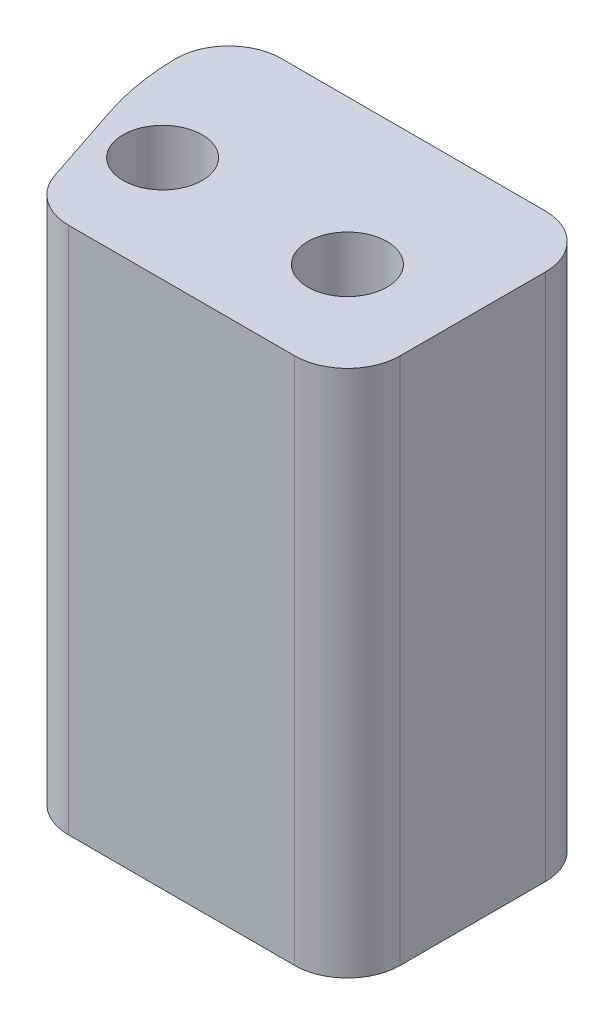
ISO-10303-21;
HEADER;
FILE_DESCRIPTION(('STEP AP214'),'2;1');
FILE_NAME('part.step','',(''),(''),'','','');
FILE_SCHEMA(('AUTOMOTIVE_DESIGN { 1 0 10303 214 1 1 1 1 }'));
ENDSEC;
DATA;
#1=APPLICATION_CONTEXT('core data for automotive mechanical design processes');
#2=APPLICATION_PROTOCOL_DEFINITION('international standard','automotive_design',2000,#1);
#3=PRODUCT_CONTEXT('',#1,'mechanical');
#4=PRODUCT('Part','Part','',(#3));
#5=PRODUCT_RELATED_PRODUCT_CATEGORY('part','',(#4));
#6=PRODUCT_DEFINITION_FORMATION('','',#4);
#7=PRODUCT_DEFINITION_CONTEXT('part definition',#1,'design');
#8=PRODUCT_DEFINITION('design','',#6,#7);
#9=PRODUCT_DEFINITION_SHAPE('','',#8);
#10=(LENGTH_UNIT() NAMED_UNIT(*) SI_UNIT(.MILLI.,.METRE.));
#11=(NAMED_UNIT(*) PLANE_ANGLE_UNIT() SI_UNIT($,.RADIAN.));
#12=(NAMED_UNIT(*) SI_UNIT($,.STERADIAN.) SOLID_ANGLE_UNIT());
#13=UNCERTAINTY_MEASURE_WITH_UNIT(LENGTH_MEASURE(1.E-05),#10,'distance_accuracy_value','');
#14=(GEOMETRIC_REPRESENTATION_CONTEXT(3) GLOBAL_UNCERTAINTY_ASSIGNED_CONTEXT((#13)) GLOBAL_UNIT_ASSIGNED_CONTEXT((#10,
#11,#12)) REPRESENTATION_CONTEXT('',''));
#15=CARTESIAN_POINT('',(0.,0.,0.));
#16=DIRECTION('',(0.,0.,1.));
#17=DIRECTION('',(1.,0.,0.));
#18=AXIS2_PLACEMENT_3D('',#15,#16,#17);
#19=CARTESIAN_POINT('',(0.,25.4,0.));
#20=DIRECTION('',(0.,1.,0.));
#21=DIRECTION('',(0.,0.,1.));
#22=AXIS2_PLACEMENT_3D('',#19,#20,#21);
#23=PLANE('',#22);
#24=CARTESIAN_POINT('',(-6.35,25.4,-3.49250000000001));
#25=DIRECTION('',(0.,1.,0.));
#26=DIRECTION('',(0.,0.,1.));
#27=AXIS2_PLACEMENT_3D('',#24,#25,#26);
#28=CIRCLE('',#27,2.54);
#29=CARTESIAN_POINT('',(-6.35,25.4,-6.03250000000001));
#30=VERTEX_POINT('',#29);
#31=CARTESIAN_POINT('',(-8.89,25.4,-3.49250000000001));
#32=VERTEX_POINT('',#31);
#33=EDGE_CURVE('E130',#30,#32,#28,.T.);
#34=ORIENTED_EDGE('',*,*,#33,.T.);
#35=CARTESIAN_POINT('',(3.80900578601359,25.4,-3.65140892609766));
#36=DIRECTION('',(0.,1.,0.));
#37=DIRECTION('',(0.,0.,1.));
#38=AXIS2_PLACEMENT_3D('',#35,#36,#37);
#39=CIRCLE('',#38,12.7);
#40=CARTESIAN_POINT('',(-8.23927209922794,25.4,0.364683702316184));
#41=VERTEX_POINT('',#40);
#42=EDGE_CURVE('E65',#32,#41,#39,.T.);
#43=ORIENTED_EDGE('',*,*,#42,.T.);
#44=DIRECTION('',(-0.316227766016838,0.,-0.948683298050514));
#45=VECTOR('',#44,1.);
#46=CARTESIAN_POINT('',(-8.89,25.4,-1.5875));
#47=LINE('',#46,#45);
#48=CARTESIAN_POINT('',(-6.92892715810574,25.4,4.29571852568276));
#49=VERTEX_POINT('',#48);
#50=EDGE_CURVE('E127',#49,#41,#47,.T.);
#51=ORIENTED_EDGE('',*,*,#50,.F.);
#52=CARTESIAN_POINT('',(-4.51927158105744,25.4,3.4925));
#53=DIRECTION('',(0.,1.,0.));
#54=DIRECTION('',(0.,0.,1.));
#55=AXIS2_PLACEMENT_3D('',#52,#53,#54);
#56=CIRCLE('',#55,2.54);
#57=CARTESIAN_POINT('',(-4.51927158105744,25.4,6.0325));
#58=VERTEX_POINT('',#57);
#59=EDGE_CURVE('E114',#49,#58,#56,.T.);
#60=ORIENTED_EDGE('',*,*,#59,.T.);
#61=DIRECTION('',(1.,0.,0.));
#62=VECTOR('',#61,1.);
#63=CARTESIAN_POINT('',(-8.89,25.4,6.03249999999999));
#64=LINE('',#63,#62);
#65=CARTESIAN_POINT('',(6.35,25.4,6.0325));
#66=VERTEX_POINT('',#65);
#67=EDGE_CURVE('E131',#58,#66,#64,.T.);
#68=ORIENTED_EDGE('',*,*,#67,.T.);
#69=CARTESIAN_POINT('',(6.35,25.4,3.4925));
#70=DIRECTION('',(0.,1.,0.));
#71=DIRECTION('',(0.,0.,1.));
#72=AXIS2_PLACEMENT_3D('',#69,#70,#71);
#73=CIRCLE('',#72,2.54);
#74=CARTESIAN_POINT('',(8.89,25.4,3.4925));
#75=VERTEX_POINT('',#74);
#76=EDGE_CURVE('E179',#66,#75,#73,.T.);
#77=ORIENTED_EDGE('',*,*,#76,.T.);
#78=DIRECTION('',(0.,0.,-1.));
#79=VECTOR('',#78,1.);
#80=CARTESIAN_POINT('',(8.89,25.4,-6.03250000000001));
#81=LINE('',#80,#79);
#82=CARTESIAN_POINT('',(8.89,25.4,-3.49250000000001));
#83=VERTEX_POINT('',#82);
#84=EDGE_CURVE('E156',#75,#83,#81,.T.);
#85=ORIENTED_EDGE('',*,*,#84,.T.);
#86=CARTESIAN_POINT('',(6.35,25.4,-3.49250000000001));
#87=DIRECTION('',(0.,1.,0.));
#88=DIRECTION('',(0.,0.,1.));
#89=AXIS2_PLACEMENT_3D('',#86,#87,#88);
#90=CIRCLE('',#89,2.54);
#91=CARTESIAN_POINT('',(6.35,25.4,-6.03250000000001));
#92=VERTEX_POINT('',#91);
#93=EDGE_CURVE('E124',#83,#92,#90,.T.);
#94=ORIENTED_EDGE('',*,*,#93,.T.);
#95=DIRECTION('',(-1.,0.,0.));
#96=VECTOR('',#95,1.);
#97=CARTESIAN_POINT('',(-8.89,25.4,-6.03250000000001));
#98=LINE('',#97,#96);
#99=EDGE_CURVE('E160',#92,#30,#98,.T.);
#100=ORIENTED_EDGE('',*,*,#99,.T.);
#101=EDGE_LOOP('',(#34,#43,#51,#60,#68,#77,#85,#94,#100));
#102=FACE_BOUND('',#101,.T.);
#103=CARTESIAN_POINT('',(-5.08,25.4,0.952499999999994));
#104=DIRECTION('',(0.,1.,0.));
#105=DIRECTION('',(0.,0.,1.));
#106=AXIS2_PLACEMENT_3D('',#103,#104,#105);
#107=CIRCLE('',#106,1.905);
#108=CARTESIAN_POINT('',(-5.08,25.4,2.85749999999999));
#109=VERTEX_POINT('',#108);
#110=EDGE_CURVE('E148',#109,#109,#107,.T.);
#111=ORIENTED_EDGE('',*,*,#110,.F.);
#112=EDGE_LOOP('',(#111));
#113=FACE_BOUND('',#112,.T.);
#114=CARTESIAN_POINT('',(3.81,25.4,0.952499999999994));
#115=DIRECTION('',(0.,1.,0.));
#116=DIRECTION('',(0.,0.,-1.));
#117=AXIS2_PLACEMENT_3D('',#114,#115,#116);
#118=CIRCLE('',#117,1.905);
#119=CARTESIAN_POINT('',(3.81,25.4,-0.952500000000005));
#120=VERTEX_POINT('',#119);
#121=EDGE_CURVE('E140',#120,#120,#118,.T.);
#122=ORIENTED_EDGE('',*,*,#121,.F.);
#123=EDGE_LOOP('',(#122));
#124=FACE_BOUND('',#123,.T.);
#125=ADVANCED_FACE('F42',(#102,#113,#124),#23,.T.);
#126=CARTESIAN_POINT('',(0.,0.,0.));
#127=DIRECTION('',(0.,1.,0.));
#128=DIRECTION('',(0.,0.,1.));
#129=AXIS2_PLACEMENT_3D('',#126,#127,#128);
#130=PLANE('',#129);
#131=DIRECTION('',(-0.316227766016838,0.,-0.948683298050514));
#132=VECTOR('',#131,1.);
#133=CARTESIAN_POINT('',(-8.89,0.,-1.5875));
#134=LINE('',#133,#132);
#135=CARTESIAN_POINT('',(-6.92892715810574,0.,4.29571852568276));
#136=VERTEX_POINT('',#135);
#137=CARTESIAN_POINT('',(-8.23927209922794,0.,0.364683702316185));
#138=VERTEX_POINT('',#137);
#139=EDGE_CURVE('E128',#136,#138,#134,.T.);
#140=ORIENTED_EDGE('',*,*,#139,.T.);
#141=CARTESIAN_POINT('',(3.80900578601359,0.,-3.65140892609766));
#142=DIRECTION('',(0.,1.,0.));
#143=DIRECTION('',(0.,0.,1.));
#144=AXIS2_PLACEMENT_3D('',#141,#142,#143);
#145=CIRCLE('',#144,12.7);
#146=CARTESIAN_POINT('',(-8.89,0.,-3.49250000000001));
#147=VERTEX_POINT('',#146);
#148=EDGE_CURVE('E11',#138,#147,#145,.F.);
#149=ORIENTED_EDGE('',*,*,#148,.T.);
#150=CARTESIAN_POINT('',(-6.35,0.,-3.49250000000001));
#151=DIRECTION('',(0.,1.,0.));
#152=DIRECTION('',(0.,0.,1.));
#153=AXIS2_PLACEMENT_3D('',#150,#151,#152);
#154=CIRCLE('',#153,2.54);
#155=CARTESIAN_POINT('',(-6.35,0.,-6.03250000000001));
#156=VERTEX_POINT('',#155);
#157=EDGE_CURVE('E188',#147,#156,#154,.F.);
#158=ORIENTED_EDGE('',*,*,#157,.T.);
#159=DIRECTION('',(-1.,0.,0.));
#160=VECTOR('',#159,1.);
#161=CARTESIAN_POINT('',(-8.89,0.,-6.03250000000001));
#162=LINE('',#161,#160);
#163=CARTESIAN_POINT('',(6.35,0.,-6.03250000000001));
#164=VERTEX_POINT('',#163);
#165=EDGE_CURVE('E170',#164,#156,#162,.T.);
#166=ORIENTED_EDGE('',*,*,#165,.F.);
#167=CARTESIAN_POINT('',(6.35,0.,-3.49250000000001));
#168=DIRECTION('',(0.,1.,0.));
#169=DIRECTION('',(0.,0.,1.));
#170=AXIS2_PLACEMENT_3D('',#167,#168,#169);
#171=CIRCLE('',#170,2.54);
#172=CARTESIAN_POINT('',(8.89,0.,-3.49250000000001));
#173=VERTEX_POINT('',#172);
#174=EDGE_CURVE('E194',#164,#173,#171,.F.);
#175=ORIENTED_EDGE('',*,*,#174,.T.);
#176=DIRECTION('',(0.,0.,-1.));
#177=VECTOR('',#176,1.);
#178=CARTESIAN_POINT('',(8.89,0.,-6.03250000000001));
#179=LINE('',#178,#177);
#180=CARTESIAN_POINT('',(8.89,0.,3.4925));
#181=VERTEX_POINT('',#180);
#182=EDGE_CURVE('E152',#181,#173,#179,.T.);
#183=ORIENTED_EDGE('',*,*,#182,.F.);
#184=CARTESIAN_POINT('',(6.35,0.,3.4925));
#185=DIRECTION('',(0.,1.,0.));
#186=DIRECTION('',(0.,0.,1.));
#187=AXIS2_PLACEMENT_3D('',#184,#185,#186);
#188=CIRCLE('',#187,2.54);
#189=CARTESIAN_POINT('',(6.35,0.,6.0325));
#190=VERTEX_POINT('',#189);
#191=EDGE_CURVE('E191',#181,#190,#188,.F.);
#192=ORIENTED_EDGE('',*,*,#191,.T.);
#193=DIRECTION('',(1.,0.,0.));
#194=VECTOR('',#193,1.);
#195=CARTESIAN_POINT('',(-8.89,0.,6.03249999999999));
#196=LINE('',#195,#194);
#197=CARTESIAN_POINT('',(-4.51927158105744,0.,6.0325));
#198=VERTEX_POINT('',#197);
#199=EDGE_CURVE('E161',#198,#190,#196,.T.);
#200=ORIENTED_EDGE('',*,*,#199,.F.);
#201=CARTESIAN_POINT('',(-4.51927158105744,0.,3.4925));
#202=DIRECTION('',(0.,1.,0.));
#203=DIRECTION('',(0.,0.,1.));
#204=AXIS2_PLACEMENT_3D('',#201,#202,#203);
#205=CIRCLE('',#204,2.54);
#206=EDGE_CURVE('E197',#198,#136,#205,.F.);
#207=ORIENTED_EDGE('',*,*,#206,.T.);
#208=EDGE_LOOP('',(#140,#149,#158,#166,#175,#183,#192,#200,#207));
#209=FACE_BOUND('',#208,.T.);
#210=CARTESIAN_POINT('',(-5.08,0.,0.952499999999994));
#211=DIRECTION('',(0.,1.,0.));
#212=DIRECTION('',(0.,0.,1.));
#213=AXIS2_PLACEMENT_3D('',#210,#211,#212);
#214=CIRCLE('',#213,1.905);
#215=CARTESIAN_POINT('',(-5.08,0.,2.85749999999999));
#216=VERTEX_POINT('',#215);
#217=EDGE_CURVE('E144',#216,#216,#214,.T.);
#218=ORIENTED_EDGE('',*,*,#217,.T.);
#219=EDGE_LOOP('',(#218));
#220=FACE_BOUND('',#219,.T.);
#221=CARTESIAN_POINT('',(3.81,0.,0.952499999999994));
#222=DIRECTION('',(0.,1.,0.));
#223=DIRECTION('',(0.,0.,-1.));
#224=AXIS2_PLACEMENT_3D('',#221,#222,#223);
#225=CIRCLE('',#224,1.905);
#226=CARTESIAN_POINT('',(3.81,0.,-0.952500000000005));
#227=VERTEX_POINT('',#226);
#228=EDGE_CURVE('E137',#227,#227,#225,.T.);
#229=ORIENTED_EDGE('',*,*,#228,.T.);
#230=EDGE_LOOP('',(#229));
#231=FACE_BOUND('',#230,.T.);
#232=ADVANCED_FACE('F230',(#209,#220,#231),#130,.F.);
#233=CARTESIAN_POINT('',(8.89,25.4,-6.03250000000001));
#234=DIRECTION('',(-1.,0.,0.));
#235=DIRECTION('',(0.,0.,1.));
#236=AXIS2_PLACEMENT_3D('',#233,#234,#235);
#237=PLANE('',#236);
#238=ORIENTED_EDGE('',*,*,#182,.T.);
#239=DIRECTION('',(0.,-1.,0.));
#240=VECTOR('',#239,1.);
#241=CARTESIAN_POINT('',(8.89,25.4,-3.49250000000001));
#242=LINE('',#241,#240);
#243=EDGE_CURVE('E211',#173,#83,#242,.F.);
#244=ORIENTED_EDGE('',*,*,#243,.T.);
#245=ORIENTED_EDGE('',*,*,#84,.F.);
#246=DIRECTION('',(0.,-1.,0.));
#247=VECTOR('',#246,1.);
#248=CARTESIAN_POINT('',(8.89,25.4,3.4925));
#249=LINE('',#248,#247);
#250=EDGE_CURVE('E207',#75,#181,#249,.T.);
#251=ORIENTED_EDGE('',*,*,#250,.T.);
#252=EDGE_LOOP('',(#238,#244,#245,#251));
#253=FACE_BOUND('',#252,.T.);
#254=ADVANCED_FACE('F242',(#253),#237,.F.);
#255=CARTESIAN_POINT('',(-8.89,25.4,-6.03250000000001));
#256=DIRECTION('',(0.,0.,1.));
#257=DIRECTION('',(1.,0.,0.));
#258=AXIS2_PLACEMENT_3D('',#255,#256,#257);
#259=PLANE('',#258);
#260=ORIENTED_EDGE('',*,*,#99,.F.);
#261=DIRECTION('',(0.,-1.,0.));
#262=VECTOR('',#261,1.);
#263=CARTESIAN_POINT('',(6.35,25.4,-6.03250000000001));
#264=LINE('',#263,#262);
#265=EDGE_CURVE('E203',#92,#164,#264,.T.);
#266=ORIENTED_EDGE('',*,*,#265,.T.);
#267=ORIENTED_EDGE('',*,*,#165,.T.);
#268=DIRECTION('',(0.,-1.,0.));
#269=VECTOR('',#268,1.);
#270=CARTESIAN_POINT('',(-6.35,25.4,-6.03250000000001));
#271=LINE('',#270,#269);
#272=EDGE_CURVE('E200',#156,#30,#271,.F.);
#273=ORIENTED_EDGE('',*,*,#272,.T.);
#274=EDGE_LOOP('',(#260,#266,#267,#273));
#275=FACE_BOUND('',#274,.T.);
#276=ADVANCED_FACE('F234',(#275),#259,.F.);
#277=CARTESIAN_POINT('',(-8.89,25.4,6.03249999999999));
#278=DIRECTION('',(0.,0.,-1.));
#279=DIRECTION('',(-1.,0.,0.));
#280=AXIS2_PLACEMENT_3D('',#277,#278,#279);
#281=PLANE('',#280);
#282=ORIENTED_EDGE('',*,*,#67,.F.);
#283=DIRECTION('',(0.,1.,0.));
#284=VECTOR('',#283,1.);
#285=CARTESIAN_POINT('',(-4.51927158105744,25.4,6.0325));
#286=LINE('',#285,#284);
#287=EDGE_CURVE('E119',#58,#198,#286,.F.);
#288=ORIENTED_EDGE('',*,*,#287,.T.);
#289=ORIENTED_EDGE('',*,*,#199,.T.);
#290=DIRECTION('',(0.,-1.,0.));
#291=VECTOR('',#290,1.);
#292=CARTESIAN_POINT('',(6.35,25.4,6.0325));
#293=LINE('',#292,#291);
#294=EDGE_CURVE('E123',#190,#66,#293,.F.);
#295=ORIENTED_EDGE('',*,*,#294,.T.);
#296=EDGE_LOOP('',(#282,#288,#289,#295));
#297=FACE_BOUND('',#296,.T.);
#298=ADVANCED_FACE('F251',(#297),#281,.F.);
#299=CARTESIAN_POINT('',(-5.08,25.4,0.952499999999994));
#300=DIRECTION('',(0.,-1.,0.));
#301=DIRECTION('',(0.,0.,-1.));
#302=AXIS2_PLACEMENT_3D('',#299,#300,#301);
#303=CYLINDRICAL_SURFACE('',#302,1.905);
#304=ORIENTED_EDGE('',*,*,#110,.T.);
#305=EDGE_LOOP('',(#304));
#306=FACE_BOUND('',#305,.T.);
#307=ORIENTED_EDGE('',*,*,#217,.F.);
#308=EDGE_LOOP('',(#307));
#309=FACE_BOUND('',#308,.T.);
#310=ADVANCED_FACE('F253',(#306,#309),#303,.F.);
#311=CARTESIAN_POINT('',(3.81,25.4,0.952499999999994));
#312=DIRECTION('',(0.,-1.,0.));
#313=DIRECTION('',(0.,0.,-1.));
#314=AXIS2_PLACEMENT_3D('',#311,#312,#313);
#315=CYLINDRICAL_SURFACE('',#314,1.905);
#316=ORIENTED_EDGE('',*,*,#121,.T.);
#317=EDGE_LOOP('',(#316));
#318=FACE_BOUND('',#317,.T.);
#319=ORIENTED_EDGE('',*,*,#228,.F.);
#320=EDGE_LOOP('',(#319));
#321=FACE_BOUND('',#320,.T.);
#322=ADVANCED_FACE('F259',(#318,#321),#315,.F.);
#323=CARTESIAN_POINT('',(-8.89,0.,-1.5875));
#324=DIRECTION('',(0.948683298050514,0.,-0.316227766016838));
#325=DIRECTION('',(-0.316227766016838,0.,-0.948683298050514));
#326=AXIS2_PLACEMENT_3D('',#323,#324,#325);
#327=PLANE('',#326);
#328=ORIENTED_EDGE('',*,*,#50,.T.);
#329=DIRECTION('',(0.,-1.,0.));
#330=VECTOR('',#329,1.);
#331=CARTESIAN_POINT('',(-8.23927209922794,0.,0.364683702316183));
#332=LINE('',#331,#330);
#333=EDGE_CURVE('E51',#41,#138,#332,.T.);
#334=ORIENTED_EDGE('',*,*,#333,.T.);
#335=ORIENTED_EDGE('',*,*,#139,.F.);
#336=DIRECTION('',(0.,1.,0.));
#337=VECTOR('',#336,1.);
#338=CARTESIAN_POINT('',(-6.92892715810574,0.,4.29571852568276));
#339=LINE('',#338,#337);
#340=EDGE_CURVE('E118',#136,#49,#339,.T.);
#341=ORIENTED_EDGE('',*,*,#340,.T.);
#342=EDGE_LOOP('',(#328,#334,#335,#341));
#343=FACE_BOUND('',#342,.T.);
#344=ADVANCED_FACE('F126',(#343),#327,.F.);
#345=CARTESIAN_POINT('',(-4.51927158105744,0.,3.4925));
#346=DIRECTION('',(0.,1.,0.));
#347=DIRECTION('',(0.,0.,1.));
#348=AXIS2_PLACEMENT_3D('',#345,#346,#347);
#349=CYLINDRICAL_SURFACE('',#348,2.54);
#350=ORIENTED_EDGE('',*,*,#206,.F.);
#351=ORIENTED_EDGE('',*,*,#287,.F.);
#352=ORIENTED_EDGE('',*,*,#59,.F.);
#353=ORIENTED_EDGE('',*,*,#340,.F.);
#354=EDGE_LOOP('',(#350,#351,#352,#353));
#355=FACE_BOUND('',#354,.T.);
#356=ADVANCED_FACE('F117',(#355),#349,.T.);
#357=CARTESIAN_POINT('',(6.35,25.4,-3.49250000000001));
#358=DIRECTION('',(0.,-1.,0.));
#359=DIRECTION('',(0.,0.,-1.));
#360=AXIS2_PLACEMENT_3D('',#357,#358,#359);
#361=CYLINDRICAL_SURFACE('',#360,2.54);
#362=ORIENTED_EDGE('',*,*,#93,.F.);
#363=ORIENTED_EDGE('',*,*,#243,.F.);
#364=ORIENTED_EDGE('',*,*,#174,.F.);
#365=ORIENTED_EDGE('',*,*,#265,.F.);
#366=EDGE_LOOP('',(#362,#363,#364,#365));
#367=FACE_BOUND('',#366,.T.);
#368=ADVANCED_FACE('F238',(#367),#361,.T.);
#369=CARTESIAN_POINT('',(6.35,25.4,3.4925));
#370=DIRECTION('',(0.,-1.,0.));
#371=DIRECTION('',(0.,0.,-1.));
#372=AXIS2_PLACEMENT_3D('',#369,#370,#371);
#373=CYLINDRICAL_SURFACE('',#372,2.54);
#374=ORIENTED_EDGE('',*,*,#76,.F.);
#375=ORIENTED_EDGE('',*,*,#294,.F.);
#376=ORIENTED_EDGE('',*,*,#191,.F.);
#377=ORIENTED_EDGE('',*,*,#250,.F.);
#378=EDGE_LOOP('',(#374,#375,#376,#377));
#379=FACE_BOUND('',#378,.T.);
#380=ADVANCED_FACE('F247',(#379),#373,.T.);
#381=CARTESIAN_POINT('',(-6.35,25.4,-3.49250000000001));
#382=DIRECTION('',(0.,-1.,0.));
#383=DIRECTION('',(0.,0.,-1.));
#384=AXIS2_PLACEMENT_3D('',#381,#382,#383);
#385=CYLINDRICAL_SURFACE('',#384,2.54);
#386=ORIENTED_EDGE('',*,*,#33,.F.);
#387=ORIENTED_EDGE('',*,*,#272,.F.);
#388=ORIENTED_EDGE('',*,*,#157,.F.);
#389=DIRECTION('',(0.,-1.,0.));
#390=VECTOR('',#389,1.);
#391=CARTESIAN_POINT('',(-8.89,25.4,-3.49250000000001));
#392=LINE('',#391,#390);
#393=EDGE_CURVE('E214',#32,#147,#392,.T.);
#394=ORIENTED_EDGE('',*,*,#393,.F.);
#395=EDGE_LOOP('',(#386,#387,#388,#394));
#396=FACE_BOUND('',#395,.T.);
#397=ADVANCED_FACE('F226',(#396),#385,.T.);
#398=CARTESIAN_POINT('',(3.80900578601359,25.4,-3.65140892609766));
#399=DIRECTION('',(0.,-1.,0.));
#400=DIRECTION('',(0.,0.,-1.));
#401=AXIS2_PLACEMENT_3D('',#398,#399,#400);
#402=CYLINDRICAL_SURFACE('',#401,12.7);
#403=ORIENTED_EDGE('',*,*,#148,.F.);
#404=ORIENTED_EDGE('',*,*,#333,.F.);
#405=ORIENTED_EDGE('',*,*,#42,.F.);
#406=ORIENTED_EDGE('',*,*,#393,.T.);
#407=EDGE_LOOP('',(#403,#404,#405,#406));
#408=FACE_BOUND('',#407,.T.);
#409=ADVANCED_FACE('F44',(#408),#402,.T.);
#410=CLOSED_SHELL('',(#125,#232,#254,#276,#298,#310,#322,#344,#356,#368,#380,#397,#409));
#411=MANIFOLD_SOLID_BREP('B2',#410);
#412=ADVANCED_BREP_SHAPE_REPRESENTATION('',(#18,#411),#14);
#413=SHAPE_DEFINITION_REPRESENTATION(#9,#412);
ENDSEC;
END-ISO-10303-21;
